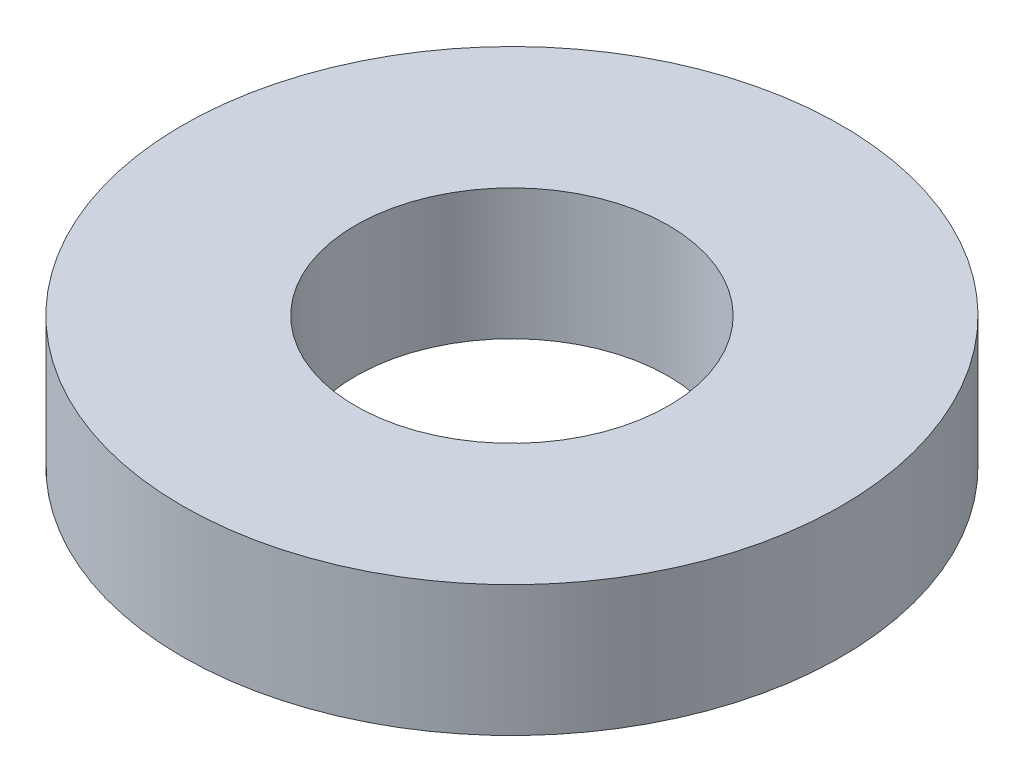
ISO-10303-21;
HEADER;
FILE_DESCRIPTION(('STEP AP214'),'2;1');
FILE_NAME('part.step','',(''),(''),'','','');
FILE_SCHEMA(('AUTOMOTIVE_DESIGN { 1 0 10303 214 1 1 1 1 }'));
ENDSEC;
DATA;
#1=APPLICATION_CONTEXT('core data for automotive mechanical design processes');
#2=APPLICATION_PROTOCOL_DEFINITION('international standard','automotive_design',2000,#1);
#3=PRODUCT_CONTEXT('',#1,'mechanical');
#4=PRODUCT('Part','Part','',(#3));
#5=PRODUCT_RELATED_PRODUCT_CATEGORY('part','',(#4));
#6=PRODUCT_DEFINITION_FORMATION('','',#4);
#7=PRODUCT_DEFINITION_CONTEXT('part definition',#1,'design');
#8=PRODUCT_DEFINITION('design','',#6,#7);
#9=PRODUCT_DEFINITION_SHAPE('','',#8);
#10=(LENGTH_UNIT() NAMED_UNIT(*) SI_UNIT(.MILLI.,.METRE.));
#11=(NAMED_UNIT(*) PLANE_ANGLE_UNIT() SI_UNIT($,.RADIAN.));
#12=(NAMED_UNIT(*) SI_UNIT($,.STERADIAN.) SOLID_ANGLE_UNIT());
#13=UNCERTAINTY_MEASURE_WITH_UNIT(LENGTH_MEASURE(1.E-05),#10,'distance_accuracy_value','');
#14=(GEOMETRIC_REPRESENTATION_CONTEXT(3) GLOBAL_UNCERTAINTY_ASSIGNED_CONTEXT((#13)) GLOBAL_UNIT_ASSIGNED_CONTEXT((#10,
#11,#12)) REPRESENTATION_CONTEXT('',''));
#15=CARTESIAN_POINT('',(0.,0.,0.));
#16=DIRECTION('',(0.,0.,1.));
#17=DIRECTION('',(1.,0.,0.));
#18=AXIS2_PLACEMENT_3D('',#15,#16,#17);
#19=CARTESIAN_POINT('',(0.,4.9,0.));
#20=DIRECTION('',(0.,-1.,0.));
#21=DIRECTION('',(0.,0.,-1.));
#22=AXIS2_PLACEMENT_3D('',#19,#20,#21);
#23=CYLINDRICAL_SURFACE('',#22,12.36);
#24=CARTESIAN_POINT('',(0.,4.9,0.));
#25=DIRECTION('',(0.,1.,0.));
#26=DIRECTION('',(0.,0.,1.));
#27=AXIS2_PLACEMENT_3D('',#24,#25,#26);
#28=CIRCLE('',#27,12.36);
#29=CARTESIAN_POINT('',(0.,4.9,12.36));
#30=VERTEX_POINT('',#29);
#31=EDGE_CURVE('E10',#30,#30,#28,.T.);
#32=ORIENTED_EDGE('',*,*,#31,.F.);
#33=EDGE_LOOP('',(#32));
#34=FACE_BOUND('',#33,.T.);
#35=CARTESIAN_POINT('',(0.,0.,0.));
#36=DIRECTION('',(0.,1.,0.));
#37=DIRECTION('',(0.,0.,1.));
#38=AXIS2_PLACEMENT_3D('',#35,#36,#37);
#39=CIRCLE('',#38,12.36);
#40=CARTESIAN_POINT('',(0.,0.,12.36));
#41=VERTEX_POINT('',#40);
#42=EDGE_CURVE('E46',#41,#41,#39,.T.);
#43=ORIENTED_EDGE('',*,*,#42,.T.);
#44=EDGE_LOOP('',(#43));
#45=FACE_BOUND('',#44,.T.);
#46=ADVANCED_FACE('F43',(#34,#45),#23,.T.);
#47=CARTESIAN_POINT('',(0.,4.9,0.));
#48=DIRECTION('',(0.,1.,0.));
#49=DIRECTION('',(0.,0.,1.));
#50=AXIS2_PLACEMENT_3D('',#47,#48,#49);
#51=PLANE('',#50);
#52=CARTESIAN_POINT('',(0.,4.9,0.));
#53=DIRECTION('',(0.,-1.,0.));
#54=DIRECTION('',(0.,0.,-1.));
#55=AXIS2_PLACEMENT_3D('',#52,#53,#54);
#56=CIRCLE('',#55,5.8674);
#57=CARTESIAN_POINT('',(0.,4.9,-5.8674));
#58=VERTEX_POINT('',#57);
#59=EDGE_CURVE('E55',#58,#58,#56,.T.);
#60=ORIENTED_EDGE('',*,*,#59,.T.);
#61=EDGE_LOOP('',(#60));
#62=FACE_BOUND('',#61,.T.);
#63=ORIENTED_EDGE('',*,*,#31,.T.);
#64=EDGE_LOOP('',(#63));
#65=FACE_BOUND('',#64,.T.);
#66=ADVANCED_FACE('F65',(#62,#65),#51,.T.);
#67=CARTESIAN_POINT('',(0.,0.,0.));
#68=DIRECTION('',(0.,1.,0.));
#69=DIRECTION('',(0.,0.,1.));
#70=AXIS2_PLACEMENT_3D('',#67,#68,#69);
#71=PLANE('',#70);
#72=CARTESIAN_POINT('',(0.,0.,0.));
#73=DIRECTION('',(0.,-1.,0.));
#74=DIRECTION('',(0.,0.,-1.));
#75=AXIS2_PLACEMENT_3D('',#72,#73,#74);
#76=CIRCLE('',#75,5.8674);
#77=CARTESIAN_POINT('',(0.,0.,-5.8674));
#78=VERTEX_POINT('',#77);
#79=EDGE_CURVE('E57',#78,#78,#76,.T.);
#80=ORIENTED_EDGE('',*,*,#79,.F.);
#81=EDGE_LOOP('',(#80));
#82=FACE_BOUND('',#81,.T.);
#83=ORIENTED_EDGE('',*,*,#42,.F.);
#84=EDGE_LOOP('',(#83));
#85=FACE_BOUND('',#84,.T.);
#86=ADVANCED_FACE('F70',(#82,#85),#71,.F.);
#87=CARTESIAN_POINT('',(0.,4.9,0.));
#88=DIRECTION('',(0.,-1.,0.));
#89=DIRECTION('',(0.,0.,-1.));
#90=AXIS2_PLACEMENT_3D('',#87,#88,#89);
#91=CYLINDRICAL_SURFACE('',#90,5.8674);
#92=ORIENTED_EDGE('',*,*,#59,.F.);
#93=EDGE_LOOP('',(#92));
#94=FACE_BOUND('',#93,.T.);
#95=ORIENTED_EDGE('',*,*,#79,.T.);
#96=EDGE_LOOP('',(#95));
#97=FACE_BOUND('',#96,.T.);
#98=ADVANCED_FACE('F67',(#94,#97),#91,.F.);
#99=CLOSED_SHELL('',(#46,#66,#86,#98));
#100=MANIFOLD_SOLID_BREP('B2',#99);
#101=ADVANCED_BREP_SHAPE_REPRESENTATION('',(#18,#100),#14);
#102=SHAPE_DEFINITION_REPRESENTATION(#9,#101);
ENDSEC;
END-ISO-10303-21;
